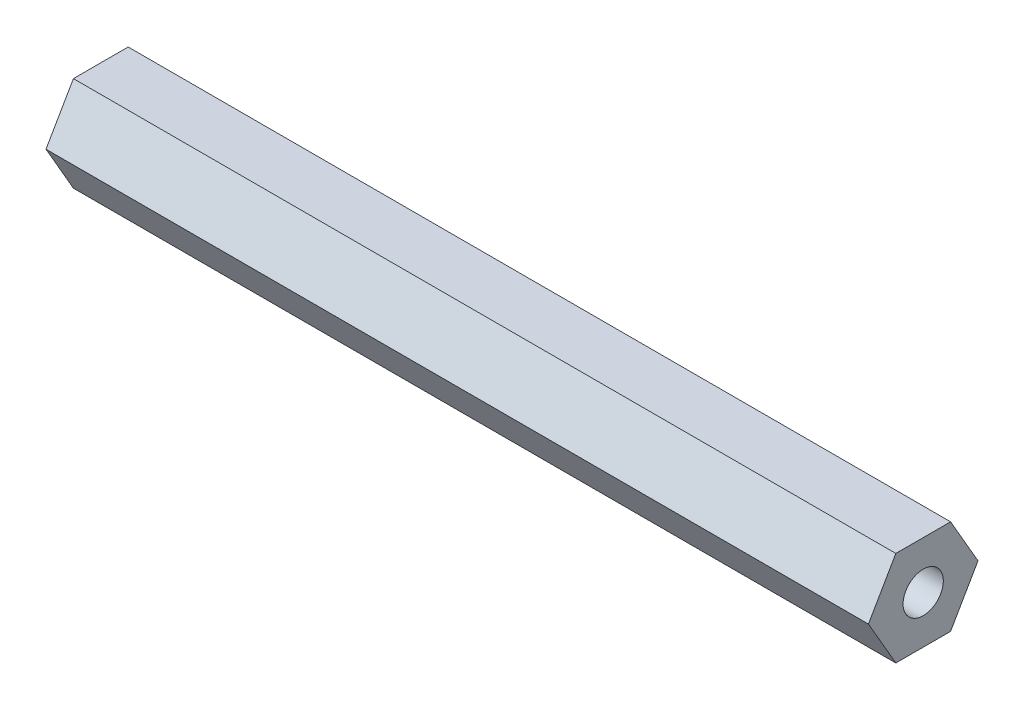
ISO-10303-21;
HEADER;
FILE_DESCRIPTION(('STEP AP214'),'2;1');
FILE_NAME('part.step','',(''),(''),'','','');
FILE_SCHEMA(('AUTOMOTIVE_DESIGN { 1 0 10303 214 1 1 1 1 }'));
ENDSEC;
DATA;
#1=APPLICATION_CONTEXT('core data for automotive mechanical design processes');
#2=APPLICATION_PROTOCOL_DEFINITION('international standard','automotive_design',2000,#1);
#3=PRODUCT_CONTEXT('',#1,'mechanical');
#4=PRODUCT('Part','Part','',(#3));
#5=PRODUCT_RELATED_PRODUCT_CATEGORY('part','',(#4));
#6=PRODUCT_DEFINITION_FORMATION('','',#4);
#7=PRODUCT_DEFINITION_CONTEXT('part definition',#1,'design');
#8=PRODUCT_DEFINITION('design','',#6,#7);
#9=PRODUCT_DEFINITION_SHAPE('','',#8);
#10=(LENGTH_UNIT() NAMED_UNIT(*) SI_UNIT(.MILLI.,.METRE.));
#11=(NAMED_UNIT(*) PLANE_ANGLE_UNIT() SI_UNIT($,.RADIAN.));
#12=(NAMED_UNIT(*) SI_UNIT($,.STERADIAN.) SOLID_ANGLE_UNIT());
#13=UNCERTAINTY_MEASURE_WITH_UNIT(LENGTH_MEASURE(1.E-05),#10,'distance_accuracy_value','');
#14=(GEOMETRIC_REPRESENTATION_CONTEXT(3) GLOBAL_UNCERTAINTY_ASSIGNED_CONTEXT((#13)) GLOBAL_UNIT_ASSIGNED_CONTEXT((#10,
#11,#12)) REPRESENTATION_CONTEXT('',''));
#15=CARTESIAN_POINT('',(0.,0.,0.));
#16=DIRECTION('',(0.,0.,1.));
#17=DIRECTION('',(1.,0.,0.));
#18=AXIS2_PLACEMENT_3D('',#15,#16,#17);
#19=CARTESIAN_POINT('',(38.1,0.,0.));
#20=DIRECTION('',(1.,0.,0.));
#21=DIRECTION('',(0.,1.,0.));
#22=AXIS2_PLACEMENT_3D('',#19,#20,#21);
#23=PLANE('',#22);
#24=CARTESIAN_POINT('',(38.1,0.,0.));
#25=DIRECTION('',(1.,0.,0.));
#26=DIRECTION('',(0.,0.,-1.));
#27=AXIS2_PLACEMENT_3D('',#24,#25,#26);
#28=CIRCLE('',#27,2.0193);
#29=CARTESIAN_POINT('',(38.1,0.,-2.0193));
#30=VERTEX_POINT('',#29);
#31=EDGE_CURVE('E49',#30,#30,#28,.T.);
#32=ORIENTED_EDGE('',*,*,#31,.F.);
#33=EDGE_LOOP('',(#32));
#34=FACE_BOUND('',#33,.T.);
#35=DIRECTION('',(0.,0.866025403784442,-0.5));
#36=VECTOR('',#35,1.);
#37=CARTESIAN_POINT('',(38.1,-4.7625,-2.74963065701564));
#38=LINE('',#37,#36);
#39=CARTESIAN_POINT('',(38.1,-4.7625,-2.74963065701564));
#40=VERTEX_POINT('',#39);
#41=CARTESIAN_POINT('',(38.1,0.,-5.49926131403117));
#42=VERTEX_POINT('',#41);
#43=EDGE_CURVE('E115',#40,#42,#38,.T.);
#44=ORIENTED_EDGE('',*,*,#43,.T.);
#45=DIRECTION('',(0.,0.866025403784438,0.5));
#46=VECTOR('',#45,1.);
#47=CARTESIAN_POINT('',(38.1,0.,-5.49926131403117));
#48=LINE('',#47,#46);
#49=CARTESIAN_POINT('',(38.1,4.7625,-2.74963065701557));
#50=VERTEX_POINT('',#49);
#51=EDGE_CURVE('E110',#42,#50,#48,.T.);
#52=ORIENTED_EDGE('',*,*,#51,.T.);
#53=DIRECTION('',(0.,0.,1.));
#54=VECTOR('',#53,1.);
#55=CARTESIAN_POINT('',(38.1,4.7625,-2.74963065701557));
#56=LINE('',#55,#54);
#57=CARTESIAN_POINT('',(38.1,4.7625,2.7496306570156));
#58=VERTEX_POINT('',#57);
#59=EDGE_CURVE('E165',#50,#58,#56,.T.);
#60=ORIENTED_EDGE('',*,*,#59,.T.);
#61=DIRECTION('',(0.,-0.866025403784442,0.5));
#62=VECTOR('',#61,1.);
#63=CARTESIAN_POINT('',(38.1,4.7625,2.7496306570156));
#64=LINE('',#63,#62);
#65=CARTESIAN_POINT('',(38.1,0.,5.49926131403117));
#66=VERTEX_POINT('',#65);
#67=EDGE_CURVE('E155',#58,#66,#64,.T.);
#68=ORIENTED_EDGE('',*,*,#67,.T.);
#69=DIRECTION('',(0.,-0.866025403784435,-0.500000000000007));
#70=VECTOR('',#69,1.);
#71=CARTESIAN_POINT('',(38.1,0.,5.49926131403117));
#72=LINE('',#71,#70);
#73=CARTESIAN_POINT('',(38.1,-4.7625,2.74963065701554));
#74=VERTEX_POINT('',#73);
#75=EDGE_CURVE('E56',#66,#74,#72,.T.);
#76=ORIENTED_EDGE('',*,*,#75,.T.);
#77=DIRECTION('',(0.,0.,-1.));
#78=VECTOR('',#77,1.);
#79=CARTESIAN_POINT('',(38.1,-4.7625,2.74963065701554));
#80=LINE('',#79,#78);
#81=EDGE_CURVE('E11',#74,#40,#80,.T.);
#82=ORIENTED_EDGE('',*,*,#81,.T.);
#83=EDGE_LOOP('',(#44,#52,#60,#68,#76,#82));
#84=FACE_BOUND('',#83,.T.);
#85=ADVANCED_FACE('F45',(#34,#84),#23,.T.);
#86=CARTESIAN_POINT('',(38.1,-4.7625,2.74963065701554));
#87=DIRECTION('',(0.,1.,0.));
#88=DIRECTION('',(0.,0.,-1.));
#89=AXIS2_PLACEMENT_3D('',#86,#87,#88);
#90=PLANE('',#89);
#91=DIRECTION('',(-1.,0.,0.));
#92=VECTOR('',#91,1.);
#93=CARTESIAN_POINT('',(38.1,-4.7625,2.74963065701554));
#94=LINE('',#93,#92);
#95=CARTESIAN_POINT('',(-44.45,-4.7625,2.74963065701554));
#96=VERTEX_POINT('',#95);
#97=EDGE_CURVE('E159',#74,#96,#94,.T.);
#98=ORIENTED_EDGE('',*,*,#97,.T.);
#99=DIRECTION('',(0.,0.,1.));
#100=VECTOR('',#99,1.);
#101=CARTESIAN_POINT('',(-44.45,-4.7625,2.74963065701554));
#102=LINE('',#101,#100);
#103=CARTESIAN_POINT('',(-44.45,-4.7625,-2.74963065701564));
#104=VERTEX_POINT('',#103);
#105=EDGE_CURVE('E125',#104,#96,#102,.T.);
#106=ORIENTED_EDGE('',*,*,#105,.F.);
#107=DIRECTION('',(-1.,0.,0.));
#108=VECTOR('',#107,1.);
#109=CARTESIAN_POINT('',(38.1,-4.7625,-2.74963065701564));
#110=LINE('',#109,#108);
#111=EDGE_CURVE('E120',#40,#104,#110,.T.);
#112=ORIENTED_EDGE('',*,*,#111,.F.);
#113=ORIENTED_EDGE('',*,*,#81,.F.);
#114=EDGE_LOOP('',(#98,#106,#112,#113));
#115=FACE_BOUND('',#114,.T.);
#116=ADVANCED_FACE('F183',(#115),#90,.F.);
#117=CARTESIAN_POINT('',(38.1,0.,5.49926131403117));
#118=DIRECTION('',(0.,0.500000000000007,-0.866025403784435));
#119=DIRECTION('',(-1.,0.,0.));
#120=AXIS2_PLACEMENT_3D('',#117,#118,#119);
#121=PLANE('',#120);
#122=DIRECTION('',(-1.,0.,0.));
#123=VECTOR('',#122,1.);
#124=CARTESIAN_POINT('',(38.1,0.,5.49926131403117));
#125=LINE('',#124,#123);
#126=CARTESIAN_POINT('',(-44.45,0.,5.49926131403117));
#127=VERTEX_POINT('',#126);
#128=EDGE_CURVE('E160',#66,#127,#125,.T.);
#129=ORIENTED_EDGE('',*,*,#128,.T.);
#130=DIRECTION('',(0.,0.866025403784434,0.500000000000008));
#131=VECTOR('',#130,1.);
#132=CARTESIAN_POINT('',(-44.45,0.,5.49926131403117));
#133=LINE('',#132,#131);
#134=EDGE_CURVE('E142',#96,#127,#133,.T.);
#135=ORIENTED_EDGE('',*,*,#134,.F.);
#136=ORIENTED_EDGE('',*,*,#97,.F.);
#137=ORIENTED_EDGE('',*,*,#75,.F.);
#138=EDGE_LOOP('',(#129,#135,#136,#137));
#139=FACE_BOUND('',#138,.T.);
#140=ADVANCED_FACE('F47',(#139),#121,.F.);
#141=CARTESIAN_POINT('',(38.1,4.7625,2.7496306570156));
#142=DIRECTION('',(0.,-0.5,-0.866025403784442));
#143=DIRECTION('',(0.,-0.866025403784442,0.5));
#144=AXIS2_PLACEMENT_3D('',#141,#142,#143);
#145=PLANE('',#144);
#146=DIRECTION('',(-1.,0.,0.));
#147=VECTOR('',#146,1.);
#148=CARTESIAN_POINT('',(38.1,4.7625,2.7496306570156));
#149=LINE('',#148,#147);
#150=CARTESIAN_POINT('',(-44.45,4.7625,2.7496306570156));
#151=VERTEX_POINT('',#150);
#152=EDGE_CURVE('E153',#58,#151,#149,.T.);
#153=ORIENTED_EDGE('',*,*,#152,.T.);
#154=DIRECTION('',(0.,0.866025403784443,-0.499999999999993));
#155=VECTOR('',#154,1.);
#156=CARTESIAN_POINT('',(-44.45,4.7625,2.7496306570156));
#157=LINE('',#156,#155);
#158=EDGE_CURVE('E146',#127,#151,#157,.T.);
#159=ORIENTED_EDGE('',*,*,#158,.F.);
#160=ORIENTED_EDGE('',*,*,#128,.F.);
#161=ORIENTED_EDGE('',*,*,#67,.F.);
#162=EDGE_LOOP('',(#153,#159,#160,#161));
#163=FACE_BOUND('',#162,.T.);
#164=ADVANCED_FACE('F186',(#163),#145,.F.);
#165=CARTESIAN_POINT('',(38.1,4.7625,-2.74963065701557));
#166=DIRECTION('',(0.,-1.,0.));
#167=DIRECTION('',(0.,0.,-1.));
#168=AXIS2_PLACEMENT_3D('',#165,#166,#167);
#169=PLANE('',#168);
#170=DIRECTION('',(-1.,0.,0.));
#171=VECTOR('',#170,1.);
#172=CARTESIAN_POINT('',(38.1,4.7625,-2.74963065701557));
#173=LINE('',#172,#171);
#174=CARTESIAN_POINT('',(-44.45,4.7625,-2.74963065701557));
#175=VERTEX_POINT('',#174);
#176=EDGE_CURVE('E154',#50,#175,#173,.T.);
#177=ORIENTED_EDGE('',*,*,#176,.T.);
#178=DIRECTION('',(0.,0.,-1.));
#179=VECTOR('',#178,1.);
#180=CARTESIAN_POINT('',(-44.45,4.7625,-2.74963065701557));
#181=LINE('',#180,#179);
#182=EDGE_CURVE('E132',#151,#175,#181,.T.);
#183=ORIENTED_EDGE('',*,*,#182,.F.);
#184=ORIENTED_EDGE('',*,*,#152,.F.);
#185=ORIENTED_EDGE('',*,*,#59,.F.);
#186=EDGE_LOOP('',(#177,#183,#184,#185));
#187=FACE_BOUND('',#186,.T.);
#188=ADVANCED_FACE('F189',(#187),#169,.F.);
#189=CARTESIAN_POINT('',(38.1,0.,-5.49926131403117));
#190=DIRECTION('',(0.,-0.5,0.866025403784438));
#191=DIRECTION('',(-1.,0.,0.));
#192=AXIS2_PLACEMENT_3D('',#189,#190,#191);
#193=PLANE('',#192);
#194=DIRECTION('',(-1.,0.,0.));
#195=VECTOR('',#194,1.);
#196=CARTESIAN_POINT('',(38.1,0.,-5.49926131403117));
#197=LINE('',#196,#195);
#198=CARTESIAN_POINT('',(-44.45,0.,-5.49926131403117));
#199=VERTEX_POINT('',#198);
#200=EDGE_CURVE('E103',#42,#199,#197,.T.);
#201=ORIENTED_EDGE('',*,*,#200,.T.);
#202=DIRECTION('',(0.,-0.866025403784438,-0.500000000000001));
#203=VECTOR('',#202,1.);
#204=CARTESIAN_POINT('',(-44.45,0.,-5.49926131403117));
#205=LINE('',#204,#203);
#206=EDGE_CURVE('E108',#175,#199,#205,.T.);
#207=ORIENTED_EDGE('',*,*,#206,.F.);
#208=ORIENTED_EDGE('',*,*,#176,.F.);
#209=ORIENTED_EDGE('',*,*,#51,.F.);
#210=EDGE_LOOP('',(#201,#207,#208,#209));
#211=FACE_BOUND('',#210,.T.);
#212=ADVANCED_FACE('F105',(#211),#193,.F.);
#213=CARTESIAN_POINT('',(38.1,-4.7625,-2.74963065701564));
#214=DIRECTION('',(0.,0.5,0.866025403784442));
#215=DIRECTION('',(1.,0.,0.));
#216=AXIS2_PLACEMENT_3D('',#213,#214,#215);
#217=PLANE('',#216);
#218=ORIENTED_EDGE('',*,*,#111,.T.);
#219=DIRECTION('',(0.,-0.866025403784444,0.499999999999991));
#220=VECTOR('',#219,1.);
#221=CARTESIAN_POINT('',(-44.45,-4.7625,-2.74963065701564));
#222=LINE('',#221,#220);
#223=EDGE_CURVE('E118',#199,#104,#222,.T.);
#224=ORIENTED_EDGE('',*,*,#223,.F.);
#225=ORIENTED_EDGE('',*,*,#200,.F.);
#226=ORIENTED_EDGE('',*,*,#43,.F.);
#227=EDGE_LOOP('',(#218,#224,#225,#226));
#228=FACE_BOUND('',#227,.T.);
#229=ADVANCED_FACE('F119',(#228),#217,.F.);
#230=CARTESIAN_POINT('',(-38.1,0.,0.));
#231=DIRECTION('',(-1.,0.,0.));
#232=DIRECTION('',(0.,0.,1.));
#233=AXIS2_PLACEMENT_3D('',#230,#231,#232);
#234=CYLINDRICAL_SURFACE('',#233,2.0193);
#235=ORIENTED_EDGE('',*,*,#31,.T.);
#236=EDGE_LOOP('',(#235));
#237=FACE_BOUND('',#236,.T.);
#238=CARTESIAN_POINT('',(-44.45,0.,0.));
#239=DIRECTION('',(-1.,0.,0.));
#240=DIRECTION('',(0.,0.,1.));
#241=AXIS2_PLACEMENT_3D('',#238,#239,#240);
#242=CIRCLE('',#241,2.0193);
#243=CARTESIAN_POINT('',(-44.45,0.,2.0193));
#244=VERTEX_POINT('',#243);
#245=EDGE_CURVE('E134',#244,#244,#242,.T.);
#246=ORIENTED_EDGE('',*,*,#245,.T.);
#247=EDGE_LOOP('',(#246));
#248=FACE_BOUND('',#247,.T.);
#249=ADVANCED_FACE('F201',(#237,#248),#234,.F.);
#250=CARTESIAN_POINT('',(-44.45,0.,0.));
#251=DIRECTION('',(1.,0.,0.));
#252=DIRECTION('',(0.,0.,-1.));
#253=AXIS2_PLACEMENT_3D('',#250,#251,#252);
#254=PLANE('',#253);
#255=ORIENTED_EDGE('',*,*,#206,.T.);
#256=ORIENTED_EDGE('',*,*,#223,.T.);
#257=ORIENTED_EDGE('',*,*,#105,.T.);
#258=ORIENTED_EDGE('',*,*,#134,.T.);
#259=ORIENTED_EDGE('',*,*,#158,.T.);
#260=ORIENTED_EDGE('',*,*,#182,.T.);
#261=EDGE_LOOP('',(#255,#256,#257,#258,#259,#260));
#262=FACE_BOUND('',#261,.T.);
#263=ORIENTED_EDGE('',*,*,#245,.F.);
#264=EDGE_LOOP('',(#263));
#265=FACE_BOUND('',#264,.T.);
#266=ADVANCED_FACE('F128',(#262,#265),#254,.F.);
#267=CLOSED_SHELL('',(#85,#116,#140,#164,#188,#212,#229,#249,#266));
#268=MANIFOLD_SOLID_BREP('B2',#267);
#269=ADVANCED_BREP_SHAPE_REPRESENTATION('',(#18,#268),#14);
#270=SHAPE_DEFINITION_REPRESENTATION(#9,#269);
ENDSEC;
END-ISO-10303-21;
